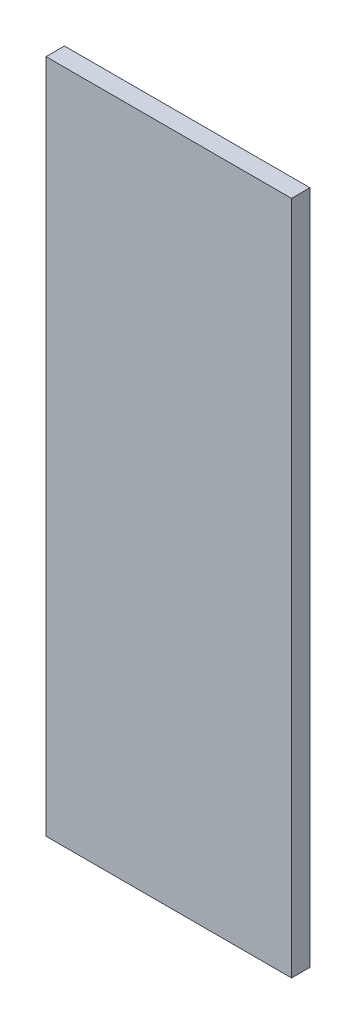
ISO-10303-21;
HEADER;
FILE_DESCRIPTION(('STEP AP214'),'2;1');
FILE_NAME('part.step','',(''),(''),'','','');
FILE_SCHEMA(('AUTOMOTIVE_DESIGN { 1 0 10303 214 1 1 1 1 }'));
ENDSEC;
DATA;
#1=APPLICATION_CONTEXT('core data for automotive mechanical design processes');
#2=APPLICATION_PROTOCOL_DEFINITION('international standard','automotive_design',2000,#1);
#3=PRODUCT_CONTEXT('',#1,'mechanical');
#4=PRODUCT('Part','Part','',(#3));
#5=PRODUCT_RELATED_PRODUCT_CATEGORY('part','',(#4));
#6=PRODUCT_DEFINITION_FORMATION('','',#4);
#7=PRODUCT_DEFINITION_CONTEXT('part definition',#1,'design');
#8=PRODUCT_DEFINITION('design','',#6,#7);
#9=PRODUCT_DEFINITION_SHAPE('','',#8);
#10=(LENGTH_UNIT() NAMED_UNIT(*) SI_UNIT(.MILLI.,.METRE.));
#11=(NAMED_UNIT(*) PLANE_ANGLE_UNIT() SI_UNIT($,.RADIAN.));
#12=(NAMED_UNIT(*) SI_UNIT($,.STERADIAN.) SOLID_ANGLE_UNIT());
#13=UNCERTAINTY_MEASURE_WITH_UNIT(LENGTH_MEASURE(1.E-05),#10,'distance_accuracy_value','');
#14=(GEOMETRIC_REPRESENTATION_CONTEXT(3) GLOBAL_UNCERTAINTY_ASSIGNED_CONTEXT((#13)) GLOBAL_UNIT_ASSIGNED_CONTEXT((#10,
#11,#12)) REPRESENTATION_CONTEXT('',''));
#15=CARTESIAN_POINT('',(0.,0.,0.));
#16=DIRECTION('',(0.,0.,1.));
#17=DIRECTION('',(1.,0.,0.));
#18=AXIS2_PLACEMENT_3D('',#15,#16,#17);
#19=CARTESIAN_POINT('',(10.,-27.5,1.5));
#20=DIRECTION('',(-1.,0.,0.));
#21=DIRECTION('',(0.,0.,1.));
#22=AXIS2_PLACEMENT_3D('',#19,#20,#21);
#23=PLANE('',#22);
#24=DIRECTION('',(0.,1.,0.));
#25=VECTOR('',#24,1.);
#26=CARTESIAN_POINT('',(10.,-27.5,0.));
#27=LINE('',#26,#25);
#28=CARTESIAN_POINT('',(10.,-27.5,0.));
#29=VERTEX_POINT('',#28);
#30=CARTESIAN_POINT('',(10.,27.5,0.));
#31=VERTEX_POINT('',#30);
#32=EDGE_CURVE('E98',#29,#31,#27,.T.);
#33=ORIENTED_EDGE('',*,*,#32,.T.);
#34=DIRECTION('',(0.,0.,-1.));
#35=VECTOR('',#34,1.);
#36=CARTESIAN_POINT('',(10.,27.5,1.5));
#37=LINE('',#36,#35);
#38=CARTESIAN_POINT('',(10.,27.5,1.5));
#39=VERTEX_POINT('',#38);
#40=EDGE_CURVE('E11',#39,#31,#37,.T.);
#41=ORIENTED_EDGE('',*,*,#40,.F.);
#42=DIRECTION('',(0.,1.,0.));
#43=VECTOR('',#42,1.);
#44=CARTESIAN_POINT('',(10.,-27.5,1.5));
#45=LINE('',#44,#43);
#46=CARTESIAN_POINT('',(10.,-27.5,1.5));
#47=VERTEX_POINT('',#46);
#48=EDGE_CURVE('E86',#47,#39,#45,.T.);
#49=ORIENTED_EDGE('',*,*,#48,.F.);
#50=DIRECTION('',(0.,0.,-1.));
#51=VECTOR('',#50,1.);
#52=CARTESIAN_POINT('',(10.,-27.5,1.5));
#53=LINE('',#52,#51);
#54=EDGE_CURVE('E94',#47,#29,#53,.T.);
#55=ORIENTED_EDGE('',*,*,#54,.T.);
#56=EDGE_LOOP('',(#33,#41,#49,#55));
#57=FACE_BOUND('',#56,.T.);
#58=ADVANCED_FACE('F35',(#57),#23,.F.);
#59=CARTESIAN_POINT('',(-10.,27.5,1.5));
#60=DIRECTION('',(0.,-1.,0.));
#61=DIRECTION('',(0.,0.,-1.));
#62=AXIS2_PLACEMENT_3D('',#59,#60,#61);
#63=PLANE('',#62);
#64=DIRECTION('',(-1.,0.,0.));
#65=VECTOR('',#64,1.);
#66=CARTESIAN_POINT('',(-10.,27.5,0.));
#67=LINE('',#66,#65);
#68=CARTESIAN_POINT('',(-10.,27.5,0.));
#69=VERTEX_POINT('',#68);
#70=EDGE_CURVE('E90',#31,#69,#67,.T.);
#71=ORIENTED_EDGE('',*,*,#70,.T.);
#72=DIRECTION('',(0.,0.,-1.));
#73=VECTOR('',#72,1.);
#74=CARTESIAN_POINT('',(-10.,27.5,1.5));
#75=LINE('',#74,#73);
#76=CARTESIAN_POINT('',(-10.,27.5,1.5));
#77=VERTEX_POINT('',#76);
#78=EDGE_CURVE('E43',#77,#69,#75,.T.);
#79=ORIENTED_EDGE('',*,*,#78,.F.);
#80=DIRECTION('',(-1.,0.,0.));
#81=VECTOR('',#80,1.);
#82=CARTESIAN_POINT('',(-10.,27.5,1.5));
#83=LINE('',#82,#81);
#84=EDGE_CURVE('E81',#39,#77,#83,.T.);
#85=ORIENTED_EDGE('',*,*,#84,.F.);
#86=ORIENTED_EDGE('',*,*,#40,.T.);
#87=EDGE_LOOP('',(#71,#79,#85,#86));
#88=FACE_BOUND('',#87,.T.);
#89=ADVANCED_FACE('F89',(#88),#63,.F.);
#90=CARTESIAN_POINT('',(-10.,-27.5,1.5));
#91=DIRECTION('',(1.,0.,0.));
#92=DIRECTION('',(0.,0.,-1.));
#93=AXIS2_PLACEMENT_3D('',#90,#91,#92);
#94=PLANE('',#93);
#95=DIRECTION('',(0.,-1.,0.));
#96=VECTOR('',#95,1.);
#97=CARTESIAN_POINT('',(-10.,-27.5,0.));
#98=LINE('',#97,#96);
#99=CARTESIAN_POINT('',(-10.,-27.5,0.));
#100=VERTEX_POINT('',#99);
#101=EDGE_CURVE('E68',#69,#100,#98,.T.);
#102=ORIENTED_EDGE('',*,*,#101,.T.);
#103=DIRECTION('',(0.,0.,-1.));
#104=VECTOR('',#103,1.);
#105=CARTESIAN_POINT('',(-10.,-27.5,1.5));
#106=LINE('',#105,#104);
#107=CARTESIAN_POINT('',(-10.,-27.5,1.5));
#108=VERTEX_POINT('',#107);
#109=EDGE_CURVE('E91',#108,#100,#106,.T.);
#110=ORIENTED_EDGE('',*,*,#109,.F.);
#111=DIRECTION('',(0.,-1.,0.));
#112=VECTOR('',#111,1.);
#113=CARTESIAN_POINT('',(-10.,-27.5,1.5));
#114=LINE('',#113,#112);
#115=EDGE_CURVE('E84',#77,#108,#114,.T.);
#116=ORIENTED_EDGE('',*,*,#115,.F.);
#117=ORIENTED_EDGE('',*,*,#78,.T.);
#118=EDGE_LOOP('',(#102,#110,#116,#117));
#119=FACE_BOUND('',#118,.T.);
#120=ADVANCED_FACE('F92',(#119),#94,.F.);
#121=CARTESIAN_POINT('',(-10.,-27.5,1.5));
#122=DIRECTION('',(0.,1.,0.));
#123=DIRECTION('',(0.,0.,1.));
#124=AXIS2_PLACEMENT_3D('',#121,#122,#123);
#125=PLANE('',#124);
#126=DIRECTION('',(1.,0.,0.));
#127=VECTOR('',#126,1.);
#128=CARTESIAN_POINT('',(-10.,-27.5,0.));
#129=LINE('',#128,#127);
#130=EDGE_CURVE('E74',#100,#29,#129,.T.);
#131=ORIENTED_EDGE('',*,*,#130,.T.);
#132=ORIENTED_EDGE('',*,*,#54,.F.);
#133=DIRECTION('',(1.,0.,0.));
#134=VECTOR('',#133,1.);
#135=CARTESIAN_POINT('',(-10.,-27.5,1.5));
#136=LINE('',#135,#134);
#137=EDGE_CURVE('E51',#108,#47,#136,.T.);
#138=ORIENTED_EDGE('',*,*,#137,.F.);
#139=ORIENTED_EDGE('',*,*,#109,.T.);
#140=EDGE_LOOP('',(#131,#132,#138,#139));
#141=FACE_BOUND('',#140,.T.);
#142=ADVANCED_FACE('F105',(#141),#125,.F.);
#143=CARTESIAN_POINT('',(0.,0.,1.5));
#144=DIRECTION('',(0.,0.,-1.));
#145=DIRECTION('',(-1.,0.,0.));
#146=AXIS2_PLACEMENT_3D('',#143,#144,#145);
#147=PLANE('',#146);
#148=ORIENTED_EDGE('',*,*,#48,.T.);
#149=ORIENTED_EDGE('',*,*,#84,.T.);
#150=ORIENTED_EDGE('',*,*,#115,.T.);
#151=ORIENTED_EDGE('',*,*,#137,.T.);
#152=EDGE_LOOP('',(#148,#149,#150,#151));
#153=FACE_BOUND('',#152,.T.);
#154=ADVANCED_FACE('F82',(#153),#147,.F.);
#155=CARTESIAN_POINT('',(0.,0.,0.));
#156=DIRECTION('',(0.,0.,-1.));
#157=DIRECTION('',(-1.,0.,0.));
#158=AXIS2_PLACEMENT_3D('',#155,#156,#157);
#159=PLANE('',#158);
#160=ORIENTED_EDGE('',*,*,#32,.F.);
#161=ORIENTED_EDGE('',*,*,#130,.F.);
#162=ORIENTED_EDGE('',*,*,#101,.F.);
#163=ORIENTED_EDGE('',*,*,#70,.F.);
#164=EDGE_LOOP('',(#160,#161,#162,#163));
#165=FACE_BOUND('',#164,.T.);
#166=ADVANCED_FACE('F108',(#165),#159,.T.);
#167=CLOSED_SHELL('',(#58,#89,#120,#142,#154,#166));
#168=MANIFOLD_SOLID_BREP('B2',#167);
#169=ADVANCED_BREP_SHAPE_REPRESENTATION('',(#18,#168),#14);
#170=SHAPE_DEFINITION_REPRESENTATION(#9,#169);
ENDSEC;
END-ISO-10303-21;
